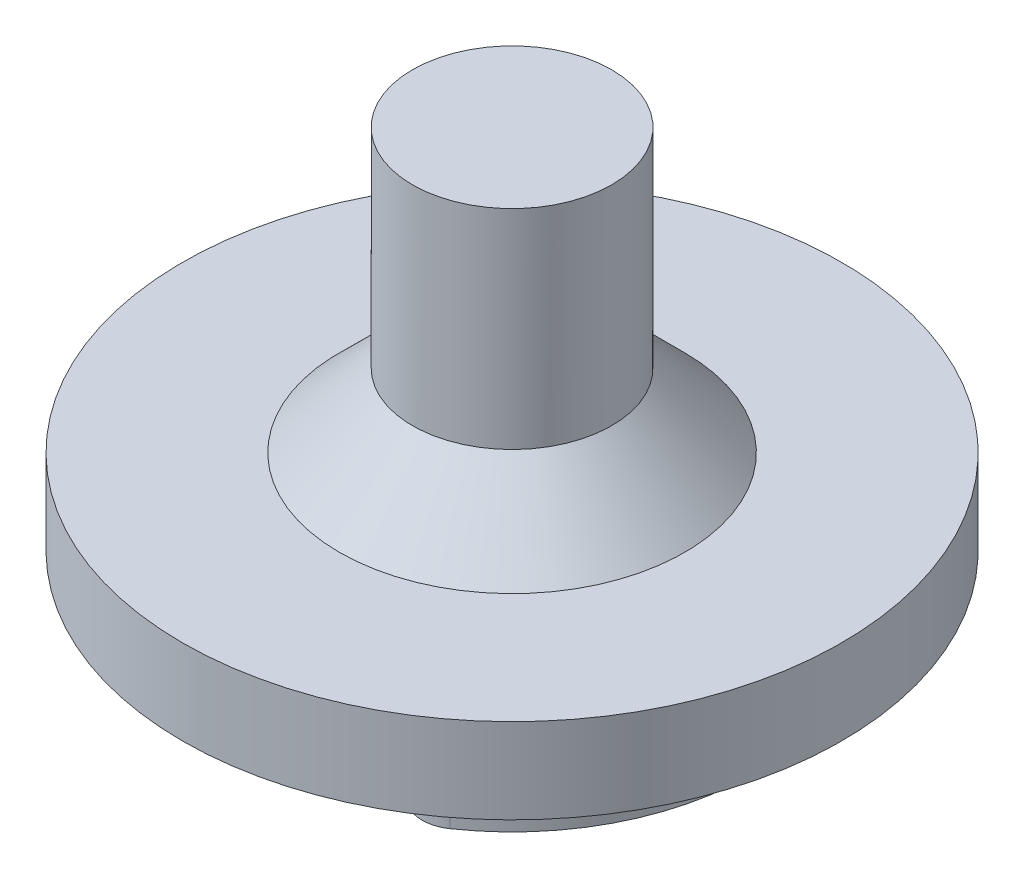
ISO-10303-21;
HEADER;
FILE_DESCRIPTION(('STEP AP214'),'2;1');
FILE_NAME('part.step','',(''),(''),'','','');
FILE_SCHEMA(('AUTOMOTIVE_DESIGN { 1 0 10303 214 1 1 1 1 }'));
ENDSEC;
DATA;
#1=APPLICATION_CONTEXT('core data for automotive mechanical design processes');
#2=APPLICATION_PROTOCOL_DEFINITION('international standard','automotive_design',2000,#1);
#3=PRODUCT_CONTEXT('',#1,'mechanical');
#4=PRODUCT('Part','Part','',(#3));
#5=PRODUCT_RELATED_PRODUCT_CATEGORY('part','',(#4));
#6=PRODUCT_DEFINITION_FORMATION('','',#4);
#7=PRODUCT_DEFINITION_CONTEXT('part definition',#1,'design');
#8=PRODUCT_DEFINITION('design','',#6,#7);
#9=PRODUCT_DEFINITION_SHAPE('','',#8);
#10=(LENGTH_UNIT() NAMED_UNIT(*) SI_UNIT(.MILLI.,.METRE.));
#11=(NAMED_UNIT(*) PLANE_ANGLE_UNIT() SI_UNIT($,.RADIAN.));
#12=(NAMED_UNIT(*) SI_UNIT($,.STERADIAN.) SOLID_ANGLE_UNIT());
#13=UNCERTAINTY_MEASURE_WITH_UNIT(LENGTH_MEASURE(1.E-05),#10,'distance_accuracy_value','');
#14=(GEOMETRIC_REPRESENTATION_CONTEXT(3) GLOBAL_UNCERTAINTY_ASSIGNED_CONTEXT((#13)) GLOBAL_UNIT_ASSIGNED_CONTEXT((#10,
#11,#12)) REPRESENTATION_CONTEXT('',''));
#15=CARTESIAN_POINT('',(0.,0.,0.));
#16=DIRECTION('',(0.,0.,1.));
#17=DIRECTION('',(1.,0.,0.));
#18=AXIS2_PLACEMENT_3D('',#15,#16,#17);
#19=CARTESIAN_POINT('',(0.,0.,0.));
#20=DIRECTION('',(0.,1.,0.));
#21=DIRECTION('',(0.,0.,1.));
#22=AXIS2_PLACEMENT_3D('',#19,#20,#21);
#23=PLANE('',#22);
#24=CARTESIAN_POINT('',(0.,0.,0.));
#25=DIRECTION('',(0.,-1.,0.));
#26=DIRECTION('',(0.,0.,-1.));
#27=AXIS2_PLACEMENT_3D('',#24,#25,#26);
#28=CIRCLE('',#27,4.5);
#29=CARTESIAN_POINT('',(-4.5,0.,0.));
#30=VERTEX_POINT('',#29);
#31=CARTESIAN_POINT('',(-2.54208185282955,0.,-3.7131953696937));
#32=VERTEX_POINT('',#31);
#33=EDGE_CURVE('E181',#30,#32,#28,.T.);
#34=ORIENTED_EDGE('',*,*,#33,.F.);
#35=CARTESIAN_POINT('',(-3.80000000000001,0.,0.));
#36=DIRECTION('',(0.,-1.,0.));
#37=DIRECTION('',(0.,0.,-1.));
#38=AXIS2_PLACEMENT_3D('',#35,#36,#37);
#39=CIRCLE('',#38,0.7);
#40=CARTESIAN_POINT('',(-3.10000000000001,0.,0.));
#41=VERTEX_POINT('',#40);
#42=EDGE_CURVE('E197',#30,#41,#39,.F.);
#43=ORIENTED_EDGE('',*,*,#42,.T.);
#44=CARTESIAN_POINT('',(0.,0.,0.));
#45=DIRECTION('',(0.,-1.,0.));
#46=DIRECTION('',(0.,0.,-1.));
#47=AXIS2_PLACEMENT_3D('',#44,#45,#46);
#48=CIRCLE('',#47,3.1);
#49=CARTESIAN_POINT('',(-1.75121194306035,0.,-2.55797903245566));
#50=VERTEX_POINT('',#49);
#51=EDGE_CURVE('E63',#41,#50,#48,.T.);
#52=ORIENTED_EDGE('',*,*,#51,.T.);
#53=CARTESIAN_POINT('',(-2.14664689794495,0.,-3.13558720107468));
#54=DIRECTION('',(0.,-1.,0.));
#55=DIRECTION('',(0.,0.,-1.));
#56=AXIS2_PLACEMENT_3D('',#53,#54,#55);
#57=CIRCLE('',#56,0.7);
#58=EDGE_CURVE('E186',#32,#50,#57,.T.);
#59=ORIENTED_EDGE('',*,*,#58,.F.);
#60=EDGE_LOOP('',(#34,#43,#52,#59));
#61=FACE_BOUND('',#60,.T.);
#62=CARTESIAN_POINT('',(0.,0.,0.));
#63=DIRECTION('',(0.,-1.,0.));
#64=DIRECTION('',(0.,0.,-1.));
#65=AXIS2_PLACEMENT_3D('',#62,#63,#64);
#66=CIRCLE('',#65,4.5);
#67=CARTESIAN_POINT('',(0.,0.,-4.5));
#68=VERTEX_POINT('',#67);
#69=CARTESIAN_POINT('',(3.7131953696937,0.,-2.54208185282955));
#70=VERTEX_POINT('',#69);
#71=EDGE_CURVE('E292',#68,#70,#66,.T.);
#72=ORIENTED_EDGE('',*,*,#71,.F.);
#73=CARTESIAN_POINT('',(0.,0.,-3.80000000000001));
#74=DIRECTION('',(0.,-1.,0.));
#75=DIRECTION('',(0.,0.,-1.));
#76=AXIS2_PLACEMENT_3D('',#73,#74,#75);
#77=CIRCLE('',#76,0.7);
#78=CARTESIAN_POINT('',(0.,0.,-3.1));
#79=VERTEX_POINT('',#78);
#80=EDGE_CURVE('E272',#68,#79,#77,.F.);
#81=ORIENTED_EDGE('',*,*,#80,.T.);
#82=CARTESIAN_POINT('',(0.,0.,0.));
#83=DIRECTION('',(0.,-1.,0.));
#84=DIRECTION('',(0.,0.,-1.));
#85=AXIS2_PLACEMENT_3D('',#82,#83,#84);
#86=CIRCLE('',#85,3.1);
#87=CARTESIAN_POINT('',(2.55797903245566,0.,-1.75121194306035));
#88=VERTEX_POINT('',#87);
#89=EDGE_CURVE('E278',#79,#88,#86,.T.);
#90=ORIENTED_EDGE('',*,*,#89,.T.);
#91=CARTESIAN_POINT('',(3.13558720107468,0.,-2.14664689794495));
#92=DIRECTION('',(0.,-1.,0.));
#93=DIRECTION('',(0.,0.,-1.));
#94=AXIS2_PLACEMENT_3D('',#91,#92,#93);
#95=CIRCLE('',#94,0.7);
#96=EDGE_CURVE('E295',#70,#88,#95,.T.);
#97=ORIENTED_EDGE('',*,*,#96,.F.);
#98=EDGE_LOOP('',(#72,#81,#90,#97));
#99=FACE_BOUND('',#98,.T.);
#100=CARTESIAN_POINT('',(0.,0.,0.));
#101=DIRECTION('',(0.,1.,0.));
#102=DIRECTION('',(0.,0.,1.));
#103=AXIS2_PLACEMENT_3D('',#100,#101,#102);
#104=CIRCLE('',#103,6.2);
#105=CARTESIAN_POINT('',(0.,0.,6.2));
#106=VERTEX_POINT('',#105);
#107=EDGE_CURVE('E322',#106,#106,#104,.T.);
#108=ORIENTED_EDGE('',*,*,#107,.F.);
#109=EDGE_LOOP('',(#108));
#110=FACE_BOUND('',#109,.T.);
#111=CARTESIAN_POINT('',(0.,0.,0.));
#112=DIRECTION('',(0.,-1.,0.));
#113=DIRECTION('',(0.,0.,-1.));
#114=AXIS2_PLACEMENT_3D('',#111,#112,#113);
#115=CIRCLE('',#114,4.5);
#116=CARTESIAN_POINT('',(4.5,0.,0.));
#117=VERTEX_POINT('',#116);
#118=CARTESIAN_POINT('',(2.54208185282955,0.,3.7131953696937));
#119=VERTEX_POINT('',#118);
#120=EDGE_CURVE('E228',#117,#119,#115,.T.);
#121=ORIENTED_EDGE('',*,*,#120,.F.);
#122=CARTESIAN_POINT('',(3.80000000000001,0.,0.));
#123=DIRECTION('',(0.,-1.,0.));
#124=DIRECTION('',(0.,0.,-1.));
#125=AXIS2_PLACEMENT_3D('',#122,#123,#124);
#126=CIRCLE('',#125,0.7);
#127=CARTESIAN_POINT('',(3.10000000000001,0.,0.));
#128=VERTEX_POINT('',#127);
#129=EDGE_CURVE('E234',#117,#128,#126,.F.);
#130=ORIENTED_EDGE('',*,*,#129,.T.);
#131=CARTESIAN_POINT('',(0.,0.,0.));
#132=DIRECTION('',(0.,-1.,0.));
#133=DIRECTION('',(0.,0.,-1.));
#134=AXIS2_PLACEMENT_3D('',#131,#132,#133);
#135=CIRCLE('',#134,3.1);
#136=CARTESIAN_POINT('',(1.75121194306035,0.,2.55797903245566));
#137=VERTEX_POINT('',#136);
#138=EDGE_CURVE('E253',#128,#137,#135,.T.);
#139=ORIENTED_EDGE('',*,*,#138,.T.);
#140=CARTESIAN_POINT('',(2.14664689794495,0.,3.13558720107468));
#141=DIRECTION('',(0.,-1.,0.));
#142=DIRECTION('',(0.,0.,-1.));
#143=AXIS2_PLACEMENT_3D('',#140,#141,#142);
#144=CIRCLE('',#143,0.7);
#145=EDGE_CURVE('E249',#119,#137,#144,.T.);
#146=ORIENTED_EDGE('',*,*,#145,.F.);
#147=EDGE_LOOP('',(#121,#130,#139,#146));
#148=FACE_BOUND('',#147,.T.);
#149=CARTESIAN_POINT('',(0.,0.,0.));
#150=DIRECTION('',(0.,-1.,0.));
#151=DIRECTION('',(0.,0.,-1.));
#152=AXIS2_PLACEMENT_3D('',#149,#150,#151);
#153=CIRCLE('',#152,4.5);
#154=CARTESIAN_POINT('',(0.,0.,4.5));
#155=VERTEX_POINT('',#154);
#156=CARTESIAN_POINT('',(-3.7131953696937,0.,2.54208185282954));
#157=VERTEX_POINT('',#156);
#158=EDGE_CURVE('E178',#155,#157,#153,.T.);
#159=ORIENTED_EDGE('',*,*,#158,.F.);
#160=CARTESIAN_POINT('',(0.,0.,3.80000000000001));
#161=DIRECTION('',(0.,-1.,0.));
#162=DIRECTION('',(0.,0.,-1.));
#163=AXIS2_PLACEMENT_3D('',#160,#161,#162);
#164=CIRCLE('',#163,0.7);
#165=CARTESIAN_POINT('',(0.,0.,3.10000000000001));
#166=VERTEX_POINT('',#165);
#167=EDGE_CURVE('E174',#155,#166,#164,.F.);
#168=ORIENTED_EDGE('',*,*,#167,.T.);
#169=CARTESIAN_POINT('',(0.,0.,0.));
#170=DIRECTION('',(0.,-1.,0.));
#171=DIRECTION('',(0.,0.,-1.));
#172=AXIS2_PLACEMENT_3D('',#169,#170,#171);
#173=CIRCLE('',#172,3.1);
#174=CARTESIAN_POINT('',(-2.55797903245566,0.,1.75121194306035));
#175=VERTEX_POINT('',#174);
#176=EDGE_CURVE('E55',#166,#175,#173,.T.);
#177=ORIENTED_EDGE('',*,*,#176,.T.);
#178=CARTESIAN_POINT('',(-3.13558720107468,0.,2.14664689794495));
#179=DIRECTION('',(0.,-1.,0.));
#180=DIRECTION('',(0.,0.,-1.));
#181=AXIS2_PLACEMENT_3D('',#178,#179,#180);
#182=CIRCLE('',#181,0.7);
#183=EDGE_CURVE('E340',#157,#175,#182,.T.);
#184=ORIENTED_EDGE('',*,*,#183,.F.);
#185=EDGE_LOOP('',(#159,#168,#177,#184));
#186=FACE_BOUND('',#185,.T.);
#187=ADVANCED_FACE('F39',(#61,#99,#110,#148,#186),#23,.F.);
#188=CARTESIAN_POINT('',(0.,1.6,0.));
#189=DIRECTION('',(0.,-1.,0.));
#190=DIRECTION('',(0.,0.,-1.));
#191=AXIS2_PLACEMENT_3D('',#188,#189,#190);
#192=CYLINDRICAL_SURFACE('',#191,6.2);
#193=CARTESIAN_POINT('',(0.,1.6,0.));
#194=DIRECTION('',(0.,1.,0.));
#195=DIRECTION('',(0.,0.,1.));
#196=AXIS2_PLACEMENT_3D('',#193,#194,#195);
#197=CIRCLE('',#196,6.2);
#198=CARTESIAN_POINT('',(0.,1.6,6.2));
#199=VERTEX_POINT('',#198);
#200=EDGE_CURVE('E48',#199,#199,#197,.T.);
#201=ORIENTED_EDGE('',*,*,#200,.F.);
#202=EDGE_LOOP('',(#201));
#203=FACE_BOUND('',#202,.T.);
#204=ORIENTED_EDGE('',*,*,#107,.T.);
#205=EDGE_LOOP('',(#204));
#206=FACE_BOUND('',#205,.T.);
#207=ADVANCED_FACE('F329',(#203,#206),#192,.T.);
#208=CARTESIAN_POINT('',(0.,1.6,0.));
#209=DIRECTION('',(0.,1.,0.));
#210=DIRECTION('',(0.,0.,1.));
#211=AXIS2_PLACEMENT_3D('',#208,#209,#210);
#212=PLANE('',#211);
#213=CARTESIAN_POINT('',(0.,1.6,0.));
#214=DIRECTION('',(0.,1.,0.));
#215=DIRECTION('',(0.,0.,1.));
#216=AXIS2_PLACEMENT_3D('',#213,#214,#215);
#217=CIRCLE('',#216,3.25);
#218=CARTESIAN_POINT('',(0.,1.6,3.25));
#219=VERTEX_POINT('',#218);
#220=EDGE_CURVE('E314',#219,#219,#217,.T.);
#221=ORIENTED_EDGE('',*,*,#220,.F.);
#222=EDGE_LOOP('',(#221));
#223=FACE_BOUND('',#222,.T.);
#224=ORIENTED_EDGE('',*,*,#200,.T.);
#225=EDGE_LOOP('',(#224));
#226=FACE_BOUND('',#225,.T.);
#227=ADVANCED_FACE('F435',(#223,#226),#212,.T.);
#228=CARTESIAN_POINT('',(0.,6.9,0.));
#229=DIRECTION('',(0.,1.,0.));
#230=DIRECTION('',(0.,0.,1.));
#231=AXIS2_PLACEMENT_3D('',#228,#229,#230);
#232=PLANE('',#231);
#233=CARTESIAN_POINT('',(0.,6.9,0.));
#234=DIRECTION('',(0.,1.,0.));
#235=DIRECTION('',(0.,0.,1.));
#236=AXIS2_PLACEMENT_3D('',#233,#234,#235);
#237=CIRCLE('',#236,1.875);
#238=CARTESIAN_POINT('',(0.,6.9,1.875));
#239=VERTEX_POINT('',#238);
#240=EDGE_CURVE('E318',#239,#239,#237,.T.);
#241=ORIENTED_EDGE('',*,*,#240,.T.);
#242=EDGE_LOOP('',(#241));
#243=FACE_BOUND('',#242,.T.);
#244=ADVANCED_FACE('F431',(#243),#232,.T.);
#245=CARTESIAN_POINT('',(0.,6.9,0.));
#246=DIRECTION('',(0.,-1.,0.));
#247=DIRECTION('',(0.,0.,-1.));
#248=AXIS2_PLACEMENT_3D('',#245,#246,#247);
#249=CYLINDRICAL_SURFACE('',#248,1.875);
#250=CARTESIAN_POINT('',(0.,2.97499999999997,0.));
#251=DIRECTION('',(0.,-1.,0.));
#252=DIRECTION('',(0.,0.,-1.));
#253=AXIS2_PLACEMENT_3D('',#250,#251,#252);
#254=CIRCLE('',#253,1.875);
#255=CARTESIAN_POINT('',(0.,2.97499999999997,-1.875));
#256=VERTEX_POINT('',#255);
#257=EDGE_CURVE('E11',#256,#256,#254,.F.);
#258=ORIENTED_EDGE('',*,*,#257,.T.);
#259=EDGE_LOOP('',(#258));
#260=FACE_BOUND('',#259,.T.);
#261=ORIENTED_EDGE('',*,*,#240,.F.);
#262=EDGE_LOOP('',(#261));
#263=FACE_BOUND('',#262,.T.);
#264=ADVANCED_FACE('F434',(#260,#263),#249,.T.);
#265=CARTESIAN_POINT('',(0.,3.4,0.));
#266=DIRECTION('',(0.,-1.,0.));
#267=DIRECTION('',(0.,0.,-1.));
#268=AXIS2_PLACEMENT_3D('',#265,#266,#267);
#269=CONICAL_SURFACE('',#268,1.44999999999997,0.785398163397453);
#270=ORIENTED_EDGE('',*,*,#220,.T.);
#271=EDGE_LOOP('',(#270));
#272=FACE_BOUND('',#271,.T.);
#273=ORIENTED_EDGE('',*,*,#257,.F.);
#274=EDGE_LOOP('',(#273));
#275=FACE_BOUND('',#274,.T.);
#276=ADVANCED_FACE('F41',(#272,#275),#269,.T.);
#277=CARTESIAN_POINT('',(0.,-1.4,-3.80000000000001));
#278=DIRECTION('',(0.,1.,0.));
#279=DIRECTION('',(0.,0.,1.));
#280=AXIS2_PLACEMENT_3D('',#277,#278,#279);
#281=CYLINDRICAL_SURFACE('',#280,0.7);
#282=ORIENTED_EDGE('',*,*,#80,.F.);
#283=DIRECTION('',(0.,1.,0.));
#284=VECTOR('',#283,1.);
#285=CARTESIAN_POINT('',(0.,-1.4,-4.5));
#286=LINE('',#285,#284);
#287=CARTESIAN_POINT('',(0.,-1.4,-4.5));
#288=VERTEX_POINT('',#287);
#289=EDGE_CURVE('E311',#288,#68,#286,.T.);
#290=ORIENTED_EDGE('',*,*,#289,.F.);
#291=CARTESIAN_POINT('',(0.,-1.4,-3.80000000000001));
#292=DIRECTION('',(0.,-1.,0.));
#293=DIRECTION('',(0.,0.,-1.));
#294=AXIS2_PLACEMENT_3D('',#291,#292,#293);
#295=CIRCLE('',#294,0.7);
#296=CARTESIAN_POINT('',(0.,-1.4,-3.1));
#297=VERTEX_POINT('',#296);
#298=EDGE_CURVE('E273',#288,#297,#295,.F.);
#299=ORIENTED_EDGE('',*,*,#298,.T.);
#300=DIRECTION('',(0.,1.,0.));
#301=VECTOR('',#300,1.);
#302=CARTESIAN_POINT('',(0.,-1.4,-3.1));
#303=LINE('',#302,#301);
#304=EDGE_CURVE('E288',#297,#79,#303,.T.);
#305=ORIENTED_EDGE('',*,*,#304,.T.);
#306=EDGE_LOOP('',(#282,#290,#299,#305));
#307=FACE_BOUND('',#306,.T.);
#308=ADVANCED_FACE('F426',(#307),#281,.T.);
#309=CARTESIAN_POINT('',(0.,-1.4,0.));
#310=DIRECTION('',(0.,1.,0.));
#311=DIRECTION('',(0.,0.,1.));
#312=AXIS2_PLACEMENT_3D('',#309,#310,#311);
#313=CYLINDRICAL_SURFACE('',#312,4.5);
#314=ORIENTED_EDGE('',*,*,#71,.T.);
#315=DIRECTION('',(0.,1.,0.));
#316=VECTOR('',#315,1.);
#317=CARTESIAN_POINT('',(3.7131953696937,-1.4,-2.54208185282955));
#318=LINE('',#317,#316);
#319=CARTESIAN_POINT('',(3.7131953696937,-1.4,-2.54208185282955));
#320=VERTEX_POINT('',#319);
#321=EDGE_CURVE('E307',#320,#70,#318,.T.);
#322=ORIENTED_EDGE('',*,*,#321,.F.);
#323=CARTESIAN_POINT('',(0.,-1.4,0.));
#324=DIRECTION('',(0.,-1.,0.));
#325=DIRECTION('',(0.,0.,-1.));
#326=AXIS2_PLACEMENT_3D('',#323,#324,#325);
#327=CIRCLE('',#326,4.5);
#328=EDGE_CURVE('E277',#288,#320,#327,.T.);
#329=ORIENTED_EDGE('',*,*,#328,.F.);
#330=ORIENTED_EDGE('',*,*,#289,.T.);
#331=EDGE_LOOP('',(#314,#322,#329,#330));
#332=FACE_BOUND('',#331,.T.);
#333=ADVANCED_FACE('F422',(#332),#313,.T.);
#334=CARTESIAN_POINT('',(3.13558720107468,-1.4,-2.14664689794495));
#335=DIRECTION('',(0.,1.,0.));
#336=DIRECTION('',(0.,0.,1.));
#337=AXIS2_PLACEMENT_3D('',#334,#335,#336);
#338=CYLINDRICAL_SURFACE('',#337,0.7);
#339=ORIENTED_EDGE('',*,*,#96,.T.);
#340=DIRECTION('',(0.,1.,0.));
#341=VECTOR('',#340,1.);
#342=CARTESIAN_POINT('',(2.55797903245566,-1.4,-1.75121194306035));
#343=LINE('',#342,#341);
#344=CARTESIAN_POINT('',(2.55797903245566,-1.4,-1.75121194306035));
#345=VERTEX_POINT('',#344);
#346=EDGE_CURVE('E303',#345,#88,#343,.T.);
#347=ORIENTED_EDGE('',*,*,#346,.F.);
#348=CARTESIAN_POINT('',(3.13558720107468,-1.4,-2.14664689794495));
#349=DIRECTION('',(0.,-1.,0.));
#350=DIRECTION('',(0.,0.,-1.));
#351=AXIS2_PLACEMENT_3D('',#348,#349,#350);
#352=CIRCLE('',#351,0.7);
#353=EDGE_CURVE('E281',#320,#345,#352,.T.);
#354=ORIENTED_EDGE('',*,*,#353,.F.);
#355=ORIENTED_EDGE('',*,*,#321,.T.);
#356=EDGE_LOOP('',(#339,#347,#354,#355));
#357=FACE_BOUND('',#356,.T.);
#358=ADVANCED_FACE('F418',(#357),#338,.T.);
#359=CARTESIAN_POINT('',(0.,-1.4,0.));
#360=DIRECTION('',(0.,1.,0.));
#361=DIRECTION('',(0.,0.,1.));
#362=AXIS2_PLACEMENT_3D('',#359,#360,#361);
#363=CYLINDRICAL_SURFACE('',#362,3.1);
#364=ORIENTED_EDGE('',*,*,#89,.F.);
#365=ORIENTED_EDGE('',*,*,#304,.F.);
#366=CARTESIAN_POINT('',(0.,-1.4,0.));
#367=DIRECTION('',(0.,-1.,0.));
#368=DIRECTION('',(0.,0.,-1.));
#369=AXIS2_PLACEMENT_3D('',#366,#367,#368);
#370=CIRCLE('',#369,3.1);
#371=EDGE_CURVE('E284',#297,#345,#370,.T.);
#372=ORIENTED_EDGE('',*,*,#371,.T.);
#373=ORIENTED_EDGE('',*,*,#346,.T.);
#374=EDGE_LOOP('',(#364,#365,#372,#373));
#375=FACE_BOUND('',#374,.T.);
#376=ADVANCED_FACE('F414',(#375),#363,.F.);
#377=CARTESIAN_POINT('',(0.,-1.4,0.));
#378=DIRECTION('',(0.,-1.,0.));
#379=DIRECTION('',(0.,0.,-1.));
#380=AXIS2_PLACEMENT_3D('',#377,#378,#379);
#381=PLANE('',#380);
#382=ORIENTED_EDGE('',*,*,#298,.F.);
#383=ORIENTED_EDGE('',*,*,#328,.T.);
#384=ORIENTED_EDGE('',*,*,#353,.T.);
#385=ORIENTED_EDGE('',*,*,#371,.F.);
#386=EDGE_LOOP('',(#382,#383,#384,#385));
#387=FACE_BOUND('',#386,.T.);
#388=ADVANCED_FACE('F410',(#387),#381,.T.);
#389=CARTESIAN_POINT('',(0.,-1.4,0.));
#390=DIRECTION('',(0.,1.,0.));
#391=DIRECTION('',(0.,0.,1.));
#392=AXIS2_PLACEMENT_3D('',#389,#390,#391);
#393=CYLINDRICAL_SURFACE('',#392,4.5);
#394=ORIENTED_EDGE('',*,*,#120,.T.);
#395=DIRECTION('',(0.,1.,0.));
#396=VECTOR('',#395,1.);
#397=CARTESIAN_POINT('',(2.54208185282955,-1.4,3.7131953696937));
#398=LINE('',#397,#396);
#399=CARTESIAN_POINT('',(2.54208185282955,-1.4,3.7131953696937));
#400=VERTEX_POINT('',#399);
#401=EDGE_CURVE('E269',#400,#119,#398,.T.);
#402=ORIENTED_EDGE('',*,*,#401,.F.);
#403=CARTESIAN_POINT('',(0.,-1.4,0.));
#404=DIRECTION('',(0.,-1.,0.));
#405=DIRECTION('',(0.,0.,-1.));
#406=AXIS2_PLACEMENT_3D('',#403,#404,#405);
#407=CIRCLE('',#406,4.5);
#408=CARTESIAN_POINT('',(4.5,-1.4,0.));
#409=VERTEX_POINT('',#408);
#410=EDGE_CURVE('E229',#409,#400,#407,.T.);
#411=ORIENTED_EDGE('',*,*,#410,.F.);
#412=DIRECTION('',(0.,1.,0.));
#413=VECTOR('',#412,1.);
#414=CARTESIAN_POINT('',(4.5,-1.4,0.));
#415=LINE('',#414,#413);
#416=EDGE_CURVE('E245',#409,#117,#415,.T.);
#417=ORIENTED_EDGE('',*,*,#416,.T.);
#418=EDGE_LOOP('',(#394,#402,#411,#417));
#419=FACE_BOUND('',#418,.T.);
#420=ADVANCED_FACE('F406',(#419),#393,.T.);
#421=CARTESIAN_POINT('',(2.14664689794495,-1.4,3.13558720107468));
#422=DIRECTION('',(0.,1.,0.));
#423=DIRECTION('',(0.,0.,1.));
#424=AXIS2_PLACEMENT_3D('',#421,#422,#423);
#425=CYLINDRICAL_SURFACE('',#424,0.7);
#426=ORIENTED_EDGE('',*,*,#145,.T.);
#427=DIRECTION('',(0.,1.,0.));
#428=VECTOR('',#427,1.);
#429=CARTESIAN_POINT('',(1.75121194306035,-1.4,2.55797903245566));
#430=LINE('',#429,#428);
#431=CARTESIAN_POINT('',(1.75121194306035,-1.4,2.55797903245566));
#432=VERTEX_POINT('',#431);
#433=EDGE_CURVE('E266',#432,#137,#430,.T.);
#434=ORIENTED_EDGE('',*,*,#433,.F.);
#435=CARTESIAN_POINT('',(2.14664689794495,-1.4,3.13558720107468));
#436=DIRECTION('',(0.,-1.,0.));
#437=DIRECTION('',(0.,0.,-1.));
#438=AXIS2_PLACEMENT_3D('',#435,#436,#437);
#439=CIRCLE('',#438,0.7);
#440=EDGE_CURVE('E233',#400,#432,#439,.T.);
#441=ORIENTED_EDGE('',*,*,#440,.F.);
#442=ORIENTED_EDGE('',*,*,#401,.T.);
#443=EDGE_LOOP('',(#426,#434,#441,#442));
#444=FACE_BOUND('',#443,.T.);
#445=ADVANCED_FACE('F402',(#444),#425,.T.);
#446=CARTESIAN_POINT('',(0.,-1.4,0.));
#447=DIRECTION('',(0.,1.,0.));
#448=DIRECTION('',(0.,0.,1.));
#449=AXIS2_PLACEMENT_3D('',#446,#447,#448);
#450=CYLINDRICAL_SURFACE('',#449,3.1);
#451=ORIENTED_EDGE('',*,*,#138,.F.);
#452=DIRECTION('',(0.,1.,0.));
#453=VECTOR('',#452,1.);
#454=CARTESIAN_POINT('',(3.1,-1.4,0.));
#455=LINE('',#454,#453);
#456=CARTESIAN_POINT('',(3.1,-1.4,0.));
#457=VERTEX_POINT('',#456);
#458=EDGE_CURVE('E262',#457,#128,#455,.T.);
#459=ORIENTED_EDGE('',*,*,#458,.F.);
#460=CARTESIAN_POINT('',(0.,-1.4,0.));
#461=DIRECTION('',(0.,-1.,0.));
#462=DIRECTION('',(0.,0.,-1.));
#463=AXIS2_PLACEMENT_3D('',#460,#461,#462);
#464=CIRCLE('',#463,3.1);
#465=EDGE_CURVE('E237',#457,#432,#464,.T.);
#466=ORIENTED_EDGE('',*,*,#465,.T.);
#467=ORIENTED_EDGE('',*,*,#433,.T.);
#468=EDGE_LOOP('',(#451,#459,#466,#467));
#469=FACE_BOUND('',#468,.T.);
#470=ADVANCED_FACE('F398',(#469),#450,.F.);
#471=CARTESIAN_POINT('',(3.80000000000001,-1.4,0.));
#472=DIRECTION('',(0.,1.,0.));
#473=DIRECTION('',(0.,0.,1.));
#474=AXIS2_PLACEMENT_3D('',#471,#472,#473);
#475=CYLINDRICAL_SURFACE('',#474,0.7);
#476=ORIENTED_EDGE('',*,*,#129,.F.);
#477=ORIENTED_EDGE('',*,*,#416,.F.);
#478=CARTESIAN_POINT('',(3.80000000000001,-1.4,0.));
#479=DIRECTION('',(0.,-1.,0.));
#480=DIRECTION('',(0.,0.,-1.));
#481=AXIS2_PLACEMENT_3D('',#478,#479,#480);
#482=CIRCLE('',#481,0.7);
#483=EDGE_CURVE('E241',#409,#457,#482,.F.);
#484=ORIENTED_EDGE('',*,*,#483,.T.);
#485=ORIENTED_EDGE('',*,*,#458,.T.);
#486=EDGE_LOOP('',(#476,#477,#484,#485));
#487=FACE_BOUND('',#486,.T.);
#488=ADVANCED_FACE('F394',(#487),#475,.T.);
#489=CARTESIAN_POINT('',(0.,-1.4,0.));
#490=DIRECTION('',(0.,-1.,0.));
#491=DIRECTION('',(0.,0.,-1.));
#492=AXIS2_PLACEMENT_3D('',#489,#490,#491);
#493=PLANE('',#492);
#494=ORIENTED_EDGE('',*,*,#410,.T.);
#495=ORIENTED_EDGE('',*,*,#440,.T.);
#496=ORIENTED_EDGE('',*,*,#465,.F.);
#497=ORIENTED_EDGE('',*,*,#483,.F.);
#498=EDGE_LOOP('',(#494,#495,#496,#497));
#499=FACE_BOUND('',#498,.T.);
#500=ADVANCED_FACE('F390',(#499),#493,.T.);
#501=CARTESIAN_POINT('',(0.,-1.4,0.));
#502=DIRECTION('',(0.,1.,0.));
#503=DIRECTION('',(0.,0.,1.));
#504=AXIS2_PLACEMENT_3D('',#501,#502,#503);
#505=CYLINDRICAL_SURFACE('',#504,4.5);
#506=ORIENTED_EDGE('',*,*,#33,.T.);
#507=DIRECTION('',(0.,1.,0.));
#508=VECTOR('',#507,1.);
#509=CARTESIAN_POINT('',(-2.54208185282955,-1.4,-3.7131953696937));
#510=LINE('',#509,#508);
#511=CARTESIAN_POINT('',(-2.54208185282955,-1.4,-3.7131953696937));
#512=VERTEX_POINT('',#511);
#513=EDGE_CURVE('E225',#512,#32,#510,.T.);
#514=ORIENTED_EDGE('',*,*,#513,.F.);
#515=CARTESIAN_POINT('',(0.,-1.4,0.));
#516=DIRECTION('',(0.,-1.,0.));
#517=DIRECTION('',(0.,0.,-1.));
#518=AXIS2_PLACEMENT_3D('',#515,#516,#517);
#519=CIRCLE('',#518,4.5);
#520=CARTESIAN_POINT('',(-4.5,-1.4,0.));
#521=VERTEX_POINT('',#520);
#522=EDGE_CURVE('E192',#521,#512,#519,.T.);
#523=ORIENTED_EDGE('',*,*,#522,.F.);
#524=DIRECTION('',(0.,1.,0.));
#525=VECTOR('',#524,1.);
#526=CARTESIAN_POINT('',(-4.5,-1.4,0.));
#527=LINE('',#526,#525);
#528=EDGE_CURVE('E207',#521,#30,#527,.T.);
#529=ORIENTED_EDGE('',*,*,#528,.T.);
#530=EDGE_LOOP('',(#506,#514,#523,#529));
#531=FACE_BOUND('',#530,.T.);
#532=ADVANCED_FACE('F386',(#531),#505,.T.);
#533=CARTESIAN_POINT('',(-2.14664689794495,-1.4,-3.13558720107468));
#534=DIRECTION('',(0.,1.,0.));
#535=DIRECTION('',(0.,0.,1.));
#536=AXIS2_PLACEMENT_3D('',#533,#534,#535);
#537=CYLINDRICAL_SURFACE('',#536,0.7);
#538=ORIENTED_EDGE('',*,*,#58,.T.);
#539=DIRECTION('',(0.,1.,0.));
#540=VECTOR('',#539,1.);
#541=CARTESIAN_POINT('',(-1.75121194306035,-1.4,-2.55797903245566));
#542=LINE('',#541,#540);
#543=CARTESIAN_POINT('',(-1.75121194306035,-1.4,-2.55797903245566));
#544=VERTEX_POINT('',#543);
#545=EDGE_CURVE('E222',#544,#50,#542,.T.);
#546=ORIENTED_EDGE('',*,*,#545,.F.);
#547=CARTESIAN_POINT('',(-2.14664689794495,-1.4,-3.13558720107468));
#548=DIRECTION('',(0.,-1.,0.));
#549=DIRECTION('',(0.,0.,-1.));
#550=AXIS2_PLACEMENT_3D('',#547,#548,#549);
#551=CIRCLE('',#550,0.7);
#552=EDGE_CURVE('E196',#512,#544,#551,.T.);
#553=ORIENTED_EDGE('',*,*,#552,.F.);
#554=ORIENTED_EDGE('',*,*,#513,.T.);
#555=EDGE_LOOP('',(#538,#546,#553,#554));
#556=FACE_BOUND('',#555,.T.);
#557=ADVANCED_FACE('F383',(#556),#537,.T.);
#558=CARTESIAN_POINT('',(0.,-1.4,0.));
#559=DIRECTION('',(0.,1.,0.));
#560=DIRECTION('',(0.,0.,1.));
#561=AXIS2_PLACEMENT_3D('',#558,#559,#560);
#562=CYLINDRICAL_SURFACE('',#561,3.1);
#563=ORIENTED_EDGE('',*,*,#51,.F.);
#564=DIRECTION('',(0.,1.,0.));
#565=VECTOR('',#564,1.);
#566=CARTESIAN_POINT('',(-3.1,-1.4,0.));
#567=LINE('',#566,#565);
#568=CARTESIAN_POINT('',(-3.1,-1.4,0.));
#569=VERTEX_POINT('',#568);
#570=EDGE_CURVE('E219',#569,#41,#567,.T.);
#571=ORIENTED_EDGE('',*,*,#570,.F.);
#572=CARTESIAN_POINT('',(0.,-1.4,0.));
#573=DIRECTION('',(0.,-1.,0.));
#574=DIRECTION('',(0.,0.,-1.));
#575=AXIS2_PLACEMENT_3D('',#572,#573,#574);
#576=CIRCLE('',#575,3.1);
#577=EDGE_CURVE('E200',#569,#544,#576,.T.);
#578=ORIENTED_EDGE('',*,*,#577,.T.);
#579=ORIENTED_EDGE('',*,*,#545,.T.);
#580=EDGE_LOOP('',(#563,#571,#578,#579));
#581=FACE_BOUND('',#580,.T.);
#582=ADVANCED_FACE('F379',(#581),#562,.F.);
#583=CARTESIAN_POINT('',(-3.80000000000001,-1.4,0.));
#584=DIRECTION('',(0.,1.,0.));
#585=DIRECTION('',(0.,0.,1.));
#586=AXIS2_PLACEMENT_3D('',#583,#584,#585);
#587=CYLINDRICAL_SURFACE('',#586,0.7);
#588=ORIENTED_EDGE('',*,*,#42,.F.);
#589=ORIENTED_EDGE('',*,*,#528,.F.);
#590=CARTESIAN_POINT('',(-3.80000000000001,-1.4,0.));
#591=DIRECTION('',(0.,-1.,0.));
#592=DIRECTION('',(0.,0.,-1.));
#593=AXIS2_PLACEMENT_3D('',#590,#591,#592);
#594=CIRCLE('',#593,0.7);
#595=EDGE_CURVE('E204',#521,#569,#594,.F.);
#596=ORIENTED_EDGE('',*,*,#595,.T.);
#597=ORIENTED_EDGE('',*,*,#570,.T.);
#598=EDGE_LOOP('',(#588,#589,#596,#597));
#599=FACE_BOUND('',#598,.T.);
#600=ADVANCED_FACE('F375',(#599),#587,.T.);
#601=CARTESIAN_POINT('',(0.,-1.4,0.));
#602=DIRECTION('',(0.,-1.,0.));
#603=DIRECTION('',(0.,0.,-1.));
#604=AXIS2_PLACEMENT_3D('',#601,#602,#603);
#605=PLANE('',#604);
#606=ORIENTED_EDGE('',*,*,#522,.T.);
#607=ORIENTED_EDGE('',*,*,#552,.T.);
#608=ORIENTED_EDGE('',*,*,#577,.F.);
#609=ORIENTED_EDGE('',*,*,#595,.F.);
#610=EDGE_LOOP('',(#606,#607,#608,#609));
#611=FACE_BOUND('',#610,.T.);
#612=ADVANCED_FACE('F372',(#611),#605,.T.);
#613=CARTESIAN_POINT('',(0.,-1.4,0.));
#614=DIRECTION('',(0.,1.,0.));
#615=DIRECTION('',(0.,0.,1.));
#616=AXIS2_PLACEMENT_3D('',#613,#614,#615);
#617=CYLINDRICAL_SURFACE('',#616,4.5);
#618=ORIENTED_EDGE('',*,*,#158,.T.);
#619=DIRECTION('',(0.,1.,0.));
#620=VECTOR('',#619,1.);
#621=CARTESIAN_POINT('',(-3.7131953696937,-1.4,2.54208185282954));
#622=LINE('',#621,#620);
#623=CARTESIAN_POINT('',(-3.7131953696937,-1.4,2.54208185282954));
#624=VERTEX_POINT('',#623);
#625=EDGE_CURVE('E157',#624,#157,#622,.T.);
#626=ORIENTED_EDGE('',*,*,#625,.F.);
#627=CARTESIAN_POINT('',(0.,-1.4,0.));
#628=DIRECTION('',(0.,-1.,0.));
#629=DIRECTION('',(0.,0.,-1.));
#630=AXIS2_PLACEMENT_3D('',#627,#628,#629);
#631=CIRCLE('',#630,4.5);
#632=CARTESIAN_POINT('',(0.,-1.4,4.5));
#633=VERTEX_POINT('',#632);
#634=EDGE_CURVE('E165',#633,#624,#631,.T.);
#635=ORIENTED_EDGE('',*,*,#634,.F.);
#636=DIRECTION('',(0.,1.,0.));
#637=VECTOR('',#636,1.);
#638=CARTESIAN_POINT('',(0.,-1.4,4.5));
#639=LINE('',#638,#637);
#640=EDGE_CURVE('E352',#633,#155,#639,.T.);
#641=ORIENTED_EDGE('',*,*,#640,.T.);
#642=EDGE_LOOP('',(#618,#626,#635,#641));
#643=FACE_BOUND('',#642,.T.);
#644=ADVANCED_FACE('F176',(#643),#617,.T.);
#645=CARTESIAN_POINT('',(-3.13558720107468,-1.4,2.14664689794495));
#646=DIRECTION('',(0.,1.,0.));
#647=DIRECTION('',(0.,0.,1.));
#648=AXIS2_PLACEMENT_3D('',#645,#646,#647);
#649=CYLINDRICAL_SURFACE('',#648,0.7);
#650=ORIENTED_EDGE('',*,*,#183,.T.);
#651=DIRECTION('',(0.,1.,0.));
#652=VECTOR('',#651,1.);
#653=CARTESIAN_POINT('',(-2.55797903245566,-1.4,1.75121194306035));
#654=LINE('',#653,#652);
#655=CARTESIAN_POINT('',(-2.55797903245566,-1.4,1.75121194306035));
#656=VERTEX_POINT('',#655);
#657=EDGE_CURVE('E159',#656,#175,#654,.T.);
#658=ORIENTED_EDGE('',*,*,#657,.F.);
#659=CARTESIAN_POINT('',(-3.13558720107468,-1.4,2.14664689794495));
#660=DIRECTION('',(0.,-1.,0.));
#661=DIRECTION('',(0.,0.,-1.));
#662=AXIS2_PLACEMENT_3D('',#659,#660,#661);
#663=CIRCLE('',#662,0.7);
#664=EDGE_CURVE('E152',#624,#656,#663,.T.);
#665=ORIENTED_EDGE('',*,*,#664,.F.);
#666=ORIENTED_EDGE('',*,*,#625,.T.);
#667=EDGE_LOOP('',(#650,#658,#665,#666));
#668=FACE_BOUND('',#667,.T.);
#669=ADVANCED_FACE('F155',(#668),#649,.T.);
#670=CARTESIAN_POINT('',(0.,-1.4,0.));
#671=DIRECTION('',(0.,1.,0.));
#672=DIRECTION('',(0.,0.,1.));
#673=AXIS2_PLACEMENT_3D('',#670,#671,#672);
#674=CYLINDRICAL_SURFACE('',#673,3.1);
#675=ORIENTED_EDGE('',*,*,#176,.F.);
#676=DIRECTION('',(0.,1.,0.));
#677=VECTOR('',#676,1.);
#678=CARTESIAN_POINT('',(0.,-1.4,3.1));
#679=LINE('',#678,#677);
#680=CARTESIAN_POINT('',(0.,-1.4,3.1));
#681=VERTEX_POINT('',#680);
#682=EDGE_CURVE('E188',#681,#166,#679,.T.);
#683=ORIENTED_EDGE('',*,*,#682,.F.);
#684=CARTESIAN_POINT('',(0.,-1.4,0.));
#685=DIRECTION('',(0.,-1.,0.));
#686=DIRECTION('',(0.,0.,-1.));
#687=AXIS2_PLACEMENT_3D('',#684,#685,#686);
#688=CIRCLE('',#687,3.1);
#689=EDGE_CURVE('E164',#681,#656,#688,.T.);
#690=ORIENTED_EDGE('',*,*,#689,.T.);
#691=ORIENTED_EDGE('',*,*,#657,.T.);
#692=EDGE_LOOP('',(#675,#683,#690,#691));
#693=FACE_BOUND('',#692,.T.);
#694=ADVANCED_FACE('F357',(#693),#674,.F.);
#695=CARTESIAN_POINT('',(0.,-1.4,3.80000000000001));
#696=DIRECTION('',(0.,1.,0.));
#697=DIRECTION('',(0.,0.,1.));
#698=AXIS2_PLACEMENT_3D('',#695,#696,#697);
#699=CYLINDRICAL_SURFACE('',#698,0.7);
#700=ORIENTED_EDGE('',*,*,#167,.F.);
#701=ORIENTED_EDGE('',*,*,#640,.F.);
#702=CARTESIAN_POINT('',(0.,-1.4,3.80000000000001));
#703=DIRECTION('',(0.,-1.,0.));
#704=DIRECTION('',(0.,0.,-1.));
#705=AXIS2_PLACEMENT_3D('',#702,#703,#704);
#706=CIRCLE('',#705,0.7);
#707=EDGE_CURVE('E171',#633,#681,#706,.F.);
#708=ORIENTED_EDGE('',*,*,#707,.T.);
#709=ORIENTED_EDGE('',*,*,#682,.T.);
#710=EDGE_LOOP('',(#700,#701,#708,#709));
#711=FACE_BOUND('',#710,.T.);
#712=ADVANCED_FACE('F356',(#711),#699,.T.);
#713=CARTESIAN_POINT('',(0.,-1.4,0.));
#714=DIRECTION('',(0.,-1.,0.));
#715=DIRECTION('',(0.,0.,-1.));
#716=AXIS2_PLACEMENT_3D('',#713,#714,#715);
#717=PLANE('',#716);
#718=ORIENTED_EDGE('',*,*,#634,.T.);
#719=ORIENTED_EDGE('',*,*,#664,.T.);
#720=ORIENTED_EDGE('',*,*,#689,.F.);
#721=ORIENTED_EDGE('',*,*,#707,.F.);
#722=EDGE_LOOP('',(#718,#719,#720,#721));
#723=FACE_BOUND('',#722,.T.);
#724=ADVANCED_FACE('F169',(#723),#717,.T.);
#725=CLOSED_SHELL('',(#187,#207,#227,#244,#264,#276,#308,#333,#358,#376,#388,#420,#445,#470,
#488,#500,#532,#557,#582,#600,#612,#644,#669,#694,#712,#724));
#726=MANIFOLD_SOLID_BREP('B2',#725);
#727=ADVANCED_BREP_SHAPE_REPRESENTATION('',(#18,#726),#14);
#728=SHAPE_DEFINITION_REPRESENTATION(#9,#727);
ENDSEC;
END-ISO-10303-21;
